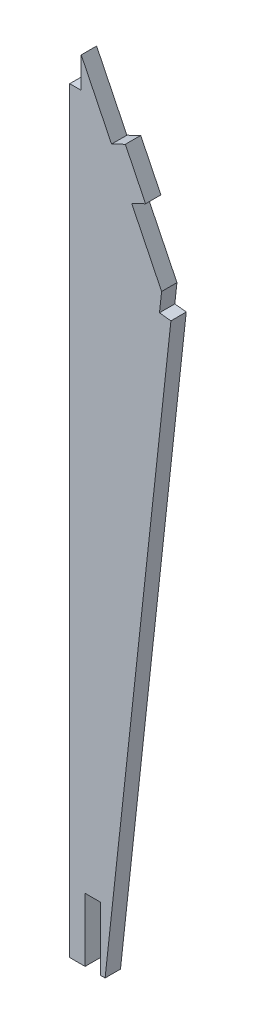
ISO-10303-21;
HEADER;
FILE_DESCRIPTION(('STEP AP214'),'2;1');
FILE_NAME('part.step','',(''),(''),'','','');
FILE_SCHEMA(('AUTOMOTIVE_DESIGN { 1 0 10303 214 1 1 1 1 }'));
ENDSEC;
DATA;
#1=APPLICATION_CONTEXT('core data for automotive mechanical design processes');
#2=APPLICATION_PROTOCOL_DEFINITION('international standard','automotive_design',2000,#1);
#3=PRODUCT_CONTEXT('',#1,'mechanical');
#4=PRODUCT('Part','Part','',(#3));
#5=PRODUCT_RELATED_PRODUCT_CATEGORY('part','',(#4));
#6=PRODUCT_DEFINITION_FORMATION('','',#4);
#7=PRODUCT_DEFINITION_CONTEXT('part definition',#1,'design');
#8=PRODUCT_DEFINITION('design','',#6,#7);
#9=PRODUCT_DEFINITION_SHAPE('','',#8);
#10=(LENGTH_UNIT() NAMED_UNIT(*) SI_UNIT(.MILLI.,.METRE.));
#11=(NAMED_UNIT(*) PLANE_ANGLE_UNIT() SI_UNIT($,.RADIAN.));
#12=(NAMED_UNIT(*) SI_UNIT($,.STERADIAN.) SOLID_ANGLE_UNIT());
#13=UNCERTAINTY_MEASURE_WITH_UNIT(LENGTH_MEASURE(1.E-05),#10,'distance_accuracy_value','');
#14=(GEOMETRIC_REPRESENTATION_CONTEXT(3) GLOBAL_UNCERTAINTY_ASSIGNED_CONTEXT((#13)) GLOBAL_UNIT_ASSIGNED_CONTEXT((#10,
#11,#12)) REPRESENTATION_CONTEXT('',''));
#15=CARTESIAN_POINT('',(0.,0.,0.));
#16=DIRECTION('',(0.,0.,1.));
#17=DIRECTION('',(1.,0.,0.));
#18=AXIS2_PLACEMENT_3D('',#15,#16,#17);
#19=CARTESIAN_POINT('',(9.18341639626626,84.0040838389916,2.));
#20=DIRECTION('',(0.108673615067687,0.994077484599727,0.));
#21=DIRECTION('',(-0.994077484599727,0.108673615067687,0.));
#22=AXIS2_PLACEMENT_3D('',#19,#20,#21);
#23=PLANE('',#22);
#24=DIRECTION('',(0.994077484599727,-0.108673615067687,0.));
#25=VECTOR('',#24,1.);
#26=CARTESIAN_POINT('',(9.18341639626626,84.0040838389916,0.));
#27=LINE('',#26,#25);
#28=CARTESIAN_POINT('',(28.3246380316323,81.9115449935266,0.));
#29=VERTEX_POINT('',#28);
#30=CARTESIAN_POINT('',(29.8157542585313,81.7485345709251,0.));
#31=VERTEX_POINT('',#30);
#32=EDGE_CURVE('E178',#29,#31,#27,.T.);
#33=ORIENTED_EDGE('',*,*,#32,.F.);
#34=DIRECTION('',(0.,0.,-1.));
#35=VECTOR('',#34,1.);
#36=CARTESIAN_POINT('',(28.3246380316323,81.9115449935266,2.));
#37=LINE('',#36,#35);
#38=CARTESIAN_POINT('',(28.3246380316323,81.9115449935266,2.));
#39=VERTEX_POINT('',#38);
#40=EDGE_CURVE('E11',#39,#29,#37,.T.);
#41=ORIENTED_EDGE('',*,*,#40,.F.);
#42=DIRECTION('',(0.994077484599727,-0.108673615067687,0.));
#43=VECTOR('',#42,1.);
#44=CARTESIAN_POINT('',(9.18341639626626,84.0040838389916,2.));
#45=LINE('',#44,#43);
#46=CARTESIAN_POINT('',(29.8157542585313,81.7485345709251,2.));
#47=VERTEX_POINT('',#46);
#48=EDGE_CURVE('E216',#39,#47,#45,.T.);
#49=ORIENTED_EDGE('',*,*,#48,.T.);
#50=DIRECTION('',(0.,0.,-1.));
#51=VECTOR('',#50,1.);
#52=CARTESIAN_POINT('',(29.8157542585313,81.7485345709251,2.));
#53=LINE('',#52,#51);
#54=EDGE_CURVE('E53',#47,#31,#53,.T.);
#55=ORIENTED_EDGE('',*,*,#54,.T.);
#56=EDGE_LOOP('',(#33,#41,#49,#55));
#57=FACE_BOUND('',#56,.T.);
#58=ADVANCED_FACE('F37',(#57),#23,.T.);
#59=CARTESIAN_POINT('',(19.1412216353933,-2.09253884546182,2.));
#60=DIRECTION('',(0.994077484599761,-0.108673615067372,0.));
#61=DIRECTION('',(0.108673615067372,0.994077484599761,0.));
#62=AXIS2_PLACEMENT_3D('',#59,#60,#61);
#63=PLANE('',#62);
#64=DIRECTION('',(-0.108673615067372,-0.994077484599761,0.));
#65=VECTOR('',#64,1.);
#66=CARTESIAN_POINT('',(19.1412216353933,-2.09253884546182,0.));
#67=LINE('',#66,#65);
#68=CARTESIAN_POINT('',(28.602188069689,84.4503971657941,0.));
#69=VERTEX_POINT('',#68);
#70=EDGE_CURVE('E180',#69,#29,#67,.T.);
#71=ORIENTED_EDGE('',*,*,#70,.F.);
#72=DIRECTION('',(0.,0.,-1.));
#73=VECTOR('',#72,1.);
#74=CARTESIAN_POINT('',(28.602188069689,84.4503971657941,2.));
#75=LINE('',#74,#73);
#76=CARTESIAN_POINT('',(28.602188069689,84.4503971657941,2.));
#77=VERTEX_POINT('',#76);
#78=EDGE_CURVE('E45',#77,#69,#75,.T.);
#79=ORIENTED_EDGE('',*,*,#78,.F.);
#80=DIRECTION('',(-0.108673615067372,-0.994077484599761,0.));
#81=VECTOR('',#80,1.);
#82=CARTESIAN_POINT('',(19.1412216353933,-2.09253884546182,2.));
#83=LINE('',#82,#81);
#84=EDGE_CURVE('E266',#77,#39,#83,.T.);
#85=ORIENTED_EDGE('',*,*,#84,.T.);
#86=ORIENTED_EDGE('',*,*,#40,.T.);
#87=EDGE_LOOP('',(#71,#79,#85,#86));
#88=FACE_BOUND('',#87,.T.);
#89=ADVANCED_FACE('F254',(#88),#63,.T.);
#90=CARTESIAN_POINT('',(56.3796372436013,27.4981864152053,2.));
#91=DIRECTION('',(0.898794046299296,0.438371146788812,0.));
#92=DIRECTION('',(-0.438371146788812,0.898794046299296,0.));
#93=AXIS2_PLACEMENT_3D('',#90,#91,#92);
#94=PLANE('',#93);
#95=DIRECTION('',(0.438371146788812,-0.898794046299296,0.));
#96=VECTOR('',#95,1.);
#97=CARTESIAN_POINT('',(56.3796372436013,27.4981864152053,0.));
#98=LINE('',#97,#96);
#99=CARTESIAN_POINT('',(24.7141798918283,92.4219952689596,0.));
#100=VERTEX_POINT('',#99);
#101=EDGE_CURVE('E183',#100,#69,#98,.T.);
#102=ORIENTED_EDGE('',*,*,#101,.F.);
#103=DIRECTION('',(0.,0.,-1.));
#104=VECTOR('',#103,1.);
#105=CARTESIAN_POINT('',(24.7141798918283,92.4219952689596,2.));
#106=LINE('',#105,#104);
#107=CARTESIAN_POINT('',(24.7141798918283,92.4219952689596,2.));
#108=VERTEX_POINT('',#107);
#109=EDGE_CURVE('E243',#108,#100,#106,.T.);
#110=ORIENTED_EDGE('',*,*,#109,.F.);
#111=DIRECTION('',(0.438371146788812,-0.898794046299296,0.));
#112=VECTOR('',#111,1.);
#113=CARTESIAN_POINT('',(56.3796372436013,27.4981864152053,2.));
#114=LINE('',#113,#112);
#115=EDGE_CURVE('E250',#108,#77,#114,.T.);
#116=ORIENTED_EDGE('',*,*,#115,.T.);
#117=ORIENTED_EDGE('',*,*,#78,.T.);
#118=EDGE_LOOP('',(#102,#110,#116,#117));
#119=FACE_BOUND('',#118,.T.);
#120=ADVANCED_FACE('F248',(#119),#94,.T.);
#121=CARTESIAN_POINT('',(-31.6654573517778,64.9238088537431,2.));
#122=DIRECTION('',(0.438371146788926,-0.898794046299241,0.));
#123=DIRECTION('',(0.898794046299241,0.438371146788927,0.));
#124=AXIS2_PLACEMENT_3D('',#121,#122,#123);
#125=PLANE('',#124);
#126=DIRECTION('',(-0.898794046299241,-0.438371146788927,0.));
#127=VECTOR('',#126,1.);
#128=CARTESIAN_POINT('',(-31.6654573517778,64.9238088537431,0.));
#129=LINE('',#128,#127);
#130=CARTESIAN_POINT('',(26.511767984427,93.2987375625376,0.));
#131=VERTEX_POINT('',#130);
#132=EDGE_CURVE('E186',#131,#100,#129,.T.);
#133=ORIENTED_EDGE('',*,*,#132,.F.);
#134=DIRECTION('',(0.,0.,-1.));
#135=VECTOR('',#134,1.);
#136=CARTESIAN_POINT('',(26.511767984427,93.2987375625376,2.));
#137=LINE('',#136,#135);
#138=CARTESIAN_POINT('',(26.511767984427,93.2987375625376,2.));
#139=VERTEX_POINT('',#138);
#140=EDGE_CURVE('E241',#139,#131,#137,.T.);
#141=ORIENTED_EDGE('',*,*,#140,.F.);
#142=DIRECTION('',(-0.898794046299241,-0.438371146788927,0.));
#143=VECTOR('',#142,1.);
#144=CARTESIAN_POINT('',(-31.6654573517778,64.9238088537431,2.));
#145=LINE('',#144,#143);
#146=EDGE_CURVE('E263',#139,#108,#145,.T.);
#147=ORIENTED_EDGE('',*,*,#146,.T.);
#148=ORIENTED_EDGE('',*,*,#109,.T.);
#149=EDGE_LOOP('',(#133,#141,#147,#148));
#150=FACE_BOUND('',#149,.T.);
#151=ADVANCED_FACE('F260',(#150),#125,.T.);
#152=CARTESIAN_POINT('',(58.1772253362309,28.3749287088587,2.));
#153=DIRECTION('',(0.898794046298927,0.438371146789569,0.));
#154=DIRECTION('',(-0.438371146789569,0.898794046298927,0.));
#155=AXIS2_PLACEMENT_3D('',#152,#153,#154);
#156=PLANE('',#155);
#157=DIRECTION('',(0.438371146789569,-0.898794046298927,0.));
#158=VECTOR('',#157,1.);
#159=CARTESIAN_POINT('',(58.1772253362309,28.3749287088587,0.));
#160=LINE('',#159,#158);
#161=CARTESIAN_POINT('',(23.8815411036894,98.6915018403315,0.));
#162=VERTEX_POINT('',#161);
#163=EDGE_CURVE('E189',#162,#131,#160,.T.);
#164=ORIENTED_EDGE('',*,*,#163,.F.);
#165=DIRECTION('',(0.,0.,-1.));
#166=VECTOR('',#165,1.);
#167=CARTESIAN_POINT('',(23.8815411036894,98.6915018403315,2.));
#168=LINE('',#167,#166);
#169=CARTESIAN_POINT('',(23.8815411036894,98.6915018403315,2.));
#170=VERTEX_POINT('',#169);
#171=EDGE_CURVE('E239',#170,#162,#168,.T.);
#172=ORIENTED_EDGE('',*,*,#171,.F.);
#173=DIRECTION('',(0.438371146789569,-0.898794046298927,0.));
#174=VECTOR('',#173,1.);
#175=CARTESIAN_POINT('',(58.1772253362309,28.3749287088587,2.));
#176=LINE('',#175,#174);
#177=EDGE_CURVE('E268',#170,#139,#176,.T.);
#178=ORIENTED_EDGE('',*,*,#177,.T.);
#179=ORIENTED_EDGE('',*,*,#140,.T.);
#180=EDGE_LOOP('',(#164,#172,#178,#179));
#181=FACE_BOUND('',#180,.T.);
#182=ADVANCED_FACE('F320',(#181),#156,.T.);
#183=CARTESIAN_POINT('',(-34.295684232511,70.3165731315401,2.));
#184=DIRECTION('',(-0.438371146788915,0.898794046299246,0.));
#185=DIRECTION('',(-0.898794046299246,-0.438371146788915,0.));
#186=AXIS2_PLACEMENT_3D('',#183,#184,#185);
#187=PLANE('',#186);
#188=DIRECTION('',(0.898794046299246,0.438371146788915,0.));
#189=VECTOR('',#188,1.);
#190=CARTESIAN_POINT('',(-34.295684232511,70.3165731315401,0.));
#191=LINE('',#190,#189);
#192=CARTESIAN_POINT('',(22.0839530110934,97.8147595467549,0.));
#193=VERTEX_POINT('',#192);
#194=EDGE_CURVE('E192',#193,#162,#191,.T.);
#195=ORIENTED_EDGE('',*,*,#194,.F.);
#196=DIRECTION('',(0.,0.,-1.));
#197=VECTOR('',#196,1.);
#198=CARTESIAN_POINT('',(22.0839530110934,97.8147595467549,2.));
#199=LINE('',#198,#197);
#200=CARTESIAN_POINT('',(22.0839530110934,97.8147595467549,2.));
#201=VERTEX_POINT('',#200);
#202=EDGE_CURVE('E237',#201,#193,#199,.T.);
#203=ORIENTED_EDGE('',*,*,#202,.F.);
#204=DIRECTION('',(0.898794046299246,0.438371146788915,0.));
#205=VECTOR('',#204,1.);
#206=CARTESIAN_POINT('',(-34.295684232511,70.3165731315401,2.));
#207=LINE('',#206,#205);
#208=EDGE_CURVE('E274',#201,#170,#207,.T.);
#209=ORIENTED_EDGE('',*,*,#208,.T.);
#210=ORIENTED_EDGE('',*,*,#171,.T.);
#211=EDGE_LOOP('',(#195,#203,#209,#210));
#212=FACE_BOUND('',#211,.T.);
#213=ADVANCED_FACE('F323',(#212),#187,.T.);
#214=CARTESIAN_POINT('',(56.3796372436186,27.4981864152449,2.));
#215=DIRECTION('',(0.898794046299101,0.438371146789213,0.));
#216=DIRECTION('',(-0.438371146789213,0.898794046299101,0.));
#217=AXIS2_PLACEMENT_3D('',#214,#215,#216);
#218=PLANE('',#217);
#219=DIRECTION('',(0.438371146789213,-0.898794046299101,0.));
#220=VECTOR('',#219,1.);
#221=CARTESIAN_POINT('',(56.3796372436186,27.4981864152449,0.));
#222=LINE('',#221,#220);
#223=CARTESIAN_POINT('',(18.1386126899906,105.903905963447,0.));
#224=VERTEX_POINT('',#223);
#225=EDGE_CURVE('E195',#224,#193,#222,.T.);
#226=ORIENTED_EDGE('',*,*,#225,.F.);
#227=DIRECTION('',(0.,0.,-1.));
#228=VECTOR('',#227,1.);
#229=CARTESIAN_POINT('',(18.1386126899906,105.903905963447,2.));
#230=LINE('',#229,#228);
#231=CARTESIAN_POINT('',(18.1386126899906,105.903905963447,2.));
#232=VERTEX_POINT('',#231);
#233=EDGE_CURVE('E235',#232,#224,#230,.T.);
#234=ORIENTED_EDGE('',*,*,#233,.F.);
#235=DIRECTION('',(0.438371146789213,-0.898794046299101,0.));
#236=VECTOR('',#235,1.);
#237=CARTESIAN_POINT('',(56.3796372436186,27.4981864152449,2.));
#238=LINE('',#237,#236);
#239=EDGE_CURVE('E277',#232,#201,#238,.T.);
#240=ORIENTED_EDGE('',*,*,#239,.T.);
#241=ORIENTED_EDGE('',*,*,#202,.T.);
#242=EDGE_LOOP('',(#226,#234,#240,#241));
#243=FACE_BOUND('',#242,.T.);
#244=ADVANCED_FACE('F327',(#243),#218,.T.);
#245=CARTESIAN_POINT('',(18.1386126899906,0.,2.));
#246=DIRECTION('',(1.,0.,0.));
#247=DIRECTION('',(0.,0.,-1.));
#248=AXIS2_PLACEMENT_3D('',#245,#246,#247);
#249=PLANE('',#248);
#250=DIRECTION('',(0.,-1.,0.));
#251=VECTOR('',#250,1.);
#252=CARTESIAN_POINT('',(18.1386126899906,0.,0.));
#253=LINE('',#252,#251);
#254=CARTESIAN_POINT('',(18.1386126899906,101.903905963448,0.));
#255=VERTEX_POINT('',#254);
#256=EDGE_CURVE('E198',#224,#255,#253,.T.);
#257=ORIENTED_EDGE('',*,*,#256,.T.);
#258=DIRECTION('',(0.,0.,-1.));
#259=VECTOR('',#258,1.);
#260=CARTESIAN_POINT('',(18.1386126899906,101.903905963448,2.));
#261=LINE('',#260,#259);
#262=CARTESIAN_POINT('',(18.1386126899906,101.903905963448,2.));
#263=VERTEX_POINT('',#262);
#264=EDGE_CURVE('E232',#263,#255,#261,.T.);
#265=ORIENTED_EDGE('',*,*,#264,.F.);
#266=DIRECTION('',(0.,-1.,0.));
#267=VECTOR('',#266,1.);
#268=CARTESIAN_POINT('',(18.1386126899906,0.,2.));
#269=LINE('',#268,#267);
#270=EDGE_CURVE('E280',#232,#263,#269,.T.);
#271=ORIENTED_EDGE('',*,*,#270,.F.);
#272=ORIENTED_EDGE('',*,*,#233,.T.);
#273=EDGE_LOOP('',(#257,#265,#271,#272));
#274=FACE_BOUND('',#273,.T.);
#275=ADVANCED_FACE('F331',(#274),#249,.F.);
#276=CARTESIAN_POINT('',(0.,101.903905963448,2.));
#277=DIRECTION('',(0.,-1.,0.));
#278=DIRECTION('',(0.,0.,-1.));
#279=AXIS2_PLACEMENT_3D('',#276,#277,#278);
#280=PLANE('',#279);
#281=DIRECTION('',(-1.,0.,0.));
#282=VECTOR('',#281,1.);
#283=CARTESIAN_POINT('',(0.,101.903905963448,0.));
#284=LINE('',#283,#282);
#285=CARTESIAN_POINT('',(16.6386126899906,101.903905963448,0.));
#286=VERTEX_POINT('',#285);
#287=EDGE_CURVE('E200',#255,#286,#284,.T.);
#288=ORIENTED_EDGE('',*,*,#287,.T.);
#289=DIRECTION('',(0.,0.,-1.));
#290=VECTOR('',#289,1.);
#291=CARTESIAN_POINT('',(16.6386126899906,101.903905963448,2.));
#292=LINE('',#291,#290);
#293=CARTESIAN_POINT('',(16.6386126899906,101.903905963448,2.));
#294=VERTEX_POINT('',#293);
#295=EDGE_CURVE('E229',#294,#286,#292,.T.);
#296=ORIENTED_EDGE('',*,*,#295,.F.);
#297=DIRECTION('',(-1.,0.,0.));
#298=VECTOR('',#297,1.);
#299=CARTESIAN_POINT('',(0.,101.903905963448,2.));
#300=LINE('',#299,#298);
#301=EDGE_CURVE('E282',#263,#294,#300,.T.);
#302=ORIENTED_EDGE('',*,*,#301,.F.);
#303=ORIENTED_EDGE('',*,*,#264,.T.);
#304=EDGE_LOOP('',(#288,#296,#302,#303));
#305=FACE_BOUND('',#304,.T.);
#306=ADVANCED_FACE('F335',(#305),#280,.F.);
#307=CARTESIAN_POINT('',(16.6386126899906,0.,2.));
#308=DIRECTION('',(1.,0.,0.));
#309=DIRECTION('',(0.,0.,-1.));
#310=AXIS2_PLACEMENT_3D('',#307,#308,#309);
#311=PLANE('',#310);
#312=DIRECTION('',(0.,-1.,0.));
#313=VECTOR('',#312,1.);
#314=CARTESIAN_POINT('',(16.6386126899906,0.,0.));
#315=LINE('',#314,#313);
#316=CARTESIAN_POINT('',(16.6386126899906,3.35464728489524,0.));
#317=VERTEX_POINT('',#316);
#318=EDGE_CURVE('E202',#286,#317,#315,.T.);
#319=ORIENTED_EDGE('',*,*,#318,.T.);
#320=DIRECTION('',(0.,0.,-1.));
#321=VECTOR('',#320,1.);
#322=CARTESIAN_POINT('',(16.6386126899906,3.35464728489524,2.));
#323=LINE('',#322,#321);
#324=CARTESIAN_POINT('',(16.6386126899906,3.35464728489524,2.));
#325=VERTEX_POINT('',#324);
#326=EDGE_CURVE('E226',#325,#317,#323,.T.);
#327=ORIENTED_EDGE('',*,*,#326,.F.);
#328=DIRECTION('',(0.,-1.,0.));
#329=VECTOR('',#328,1.);
#330=CARTESIAN_POINT('',(16.6386126899906,0.,2.));
#331=LINE('',#330,#329);
#332=EDGE_CURVE('E284',#294,#325,#331,.T.);
#333=ORIENTED_EDGE('',*,*,#332,.F.);
#334=ORIENTED_EDGE('',*,*,#295,.T.);
#335=EDGE_LOOP('',(#319,#327,#333,#334));
#336=FACE_BOUND('',#335,.T.);
#337=ADVANCED_FACE('F339',(#336),#311,.F.);
#338=CARTESIAN_POINT('',(0.,3.35464728489524,2.));
#339=DIRECTION('',(0.,1.,0.));
#340=DIRECTION('',(0.,0.,1.));
#341=AXIS2_PLACEMENT_3D('',#338,#339,#340);
#342=PLANE('',#341);
#343=DIRECTION('',(1.,0.,0.));
#344=VECTOR('',#343,1.);
#345=CARTESIAN_POINT('',(0.,3.35464728489524,0.));
#346=LINE('',#345,#344);
#347=CARTESIAN_POINT('',(18.6386126899915,3.35464728489524,0.));
#348=VERTEX_POINT('',#347);
#349=EDGE_CURVE('E204',#317,#348,#346,.T.);
#350=ORIENTED_EDGE('',*,*,#349,.T.);
#351=DIRECTION('',(0.,0.,-1.));
#352=VECTOR('',#351,1.);
#353=CARTESIAN_POINT('',(18.6386126899915,3.35464728489524,2.));
#354=LINE('',#353,#352);
#355=CARTESIAN_POINT('',(18.6386126899915,3.35464728489524,2.));
#356=VERTEX_POINT('',#355);
#357=EDGE_CURVE('E223',#356,#348,#354,.T.);
#358=ORIENTED_EDGE('',*,*,#357,.F.);
#359=DIRECTION('',(1.,0.,0.));
#360=VECTOR('',#359,1.);
#361=CARTESIAN_POINT('',(0.,3.35464728489524,2.));
#362=LINE('',#361,#360);
#363=EDGE_CURVE('E286',#325,#356,#362,.T.);
#364=ORIENTED_EDGE('',*,*,#363,.F.);
#365=ORIENTED_EDGE('',*,*,#326,.T.);
#366=EDGE_LOOP('',(#350,#358,#364,#365));
#367=FACE_BOUND('',#366,.T.);
#368=ADVANCED_FACE('F343',(#367),#342,.F.);
#369=CARTESIAN_POINT('',(18.6386126899915,0.,2.));
#370=DIRECTION('',(-1.,0.,0.));
#371=DIRECTION('',(0.,0.,1.));
#372=AXIS2_PLACEMENT_3D('',#369,#370,#371);
#373=PLANE('',#372);
#374=DIRECTION('',(0.,1.,0.));
#375=VECTOR('',#374,1.);
#376=CARTESIAN_POINT('',(18.6386126899915,0.,0.));
#377=LINE('',#376,#375);
#378=CARTESIAN_POINT('',(18.6386126899915,11.6046472849062,0.));
#379=VERTEX_POINT('',#378);
#380=EDGE_CURVE('E206',#348,#379,#377,.T.);
#381=ORIENTED_EDGE('',*,*,#380,.T.);
#382=DIRECTION('',(0.,0.,-1.));
#383=VECTOR('',#382,1.);
#384=CARTESIAN_POINT('',(18.6386126899915,11.6046472849062,2.));
#385=LINE('',#384,#383);
#386=CARTESIAN_POINT('',(18.6386126899915,11.6046472849062,2.));
#387=VERTEX_POINT('',#386);
#388=EDGE_CURVE('E220',#387,#379,#385,.T.);
#389=ORIENTED_EDGE('',*,*,#388,.F.);
#390=DIRECTION('',(0.,1.,0.));
#391=VECTOR('',#390,1.);
#392=CARTESIAN_POINT('',(18.6386126899915,0.,2.));
#393=LINE('',#392,#391);
#394=EDGE_CURVE('E288',#356,#387,#393,.T.);
#395=ORIENTED_EDGE('',*,*,#394,.F.);
#396=ORIENTED_EDGE('',*,*,#357,.T.);
#397=EDGE_LOOP('',(#381,#389,#395,#396));
#398=FACE_BOUND('',#397,.T.);
#399=ADVANCED_FACE('F294',(#398),#373,.F.);
#400=CARTESIAN_POINT('',(0.,11.6046472849062,2.));
#401=DIRECTION('',(0.,1.,0.));
#402=DIRECTION('',(0.,0.,1.));
#403=AXIS2_PLACEMENT_3D('',#400,#401,#402);
#404=PLANE('',#403);
#405=DIRECTION('',(1.,0.,0.));
#406=VECTOR('',#405,1.);
#407=CARTESIAN_POINT('',(0.,11.6046472849062,0.));
#408=LINE('',#407,#406);
#409=CARTESIAN_POINT('',(20.6386126899915,11.6046472849062,0.));
#410=VERTEX_POINT('',#409);
#411=EDGE_CURVE('E208',#379,#410,#408,.T.);
#412=ORIENTED_EDGE('',*,*,#411,.T.);
#413=DIRECTION('',(0.,0.,-1.));
#414=VECTOR('',#413,1.);
#415=CARTESIAN_POINT('',(20.6386126899915,11.6046472849062,2.));
#416=LINE('',#415,#414);
#417=CARTESIAN_POINT('',(20.6386126899915,11.6046472849062,2.));
#418=VERTEX_POINT('',#417);
#419=EDGE_CURVE('E170',#418,#410,#416,.T.);
#420=ORIENTED_EDGE('',*,*,#419,.F.);
#421=DIRECTION('',(1.,0.,0.));
#422=VECTOR('',#421,1.);
#423=CARTESIAN_POINT('',(0.,11.6046472849062,2.));
#424=LINE('',#423,#422);
#425=EDGE_CURVE('E158',#387,#418,#424,.T.);
#426=ORIENTED_EDGE('',*,*,#425,.F.);
#427=ORIENTED_EDGE('',*,*,#388,.T.);
#428=EDGE_LOOP('',(#412,#420,#426,#427));
#429=FACE_BOUND('',#428,.T.);
#430=ADVANCED_FACE('F298',(#429),#404,.F.);
#431=CARTESIAN_POINT('',(20.6386126899915,0.,2.));
#432=DIRECTION('',(1.,0.,0.));
#433=DIRECTION('',(0.,0.,-1.));
#434=AXIS2_PLACEMENT_3D('',#431,#432,#433);
#435=PLANE('',#434);
#436=DIRECTION('',(0.,-1.,0.));
#437=VECTOR('',#436,1.);
#438=CARTESIAN_POINT('',(20.6386126899915,0.,0.));
#439=LINE('',#438,#437);
#440=CARTESIAN_POINT('',(20.6386126899915,3.35464728489524,0.));
#441=VERTEX_POINT('',#440);
#442=EDGE_CURVE('E167',#410,#441,#439,.T.);
#443=ORIENTED_EDGE('',*,*,#442,.T.);
#444=DIRECTION('',(0.,0.,-1.));
#445=VECTOR('',#444,1.);
#446=CARTESIAN_POINT('',(20.6386126899915,3.35464728489524,2.));
#447=LINE('',#446,#445);
#448=CARTESIAN_POINT('',(20.6386126899915,3.35464728489524,2.));
#449=VERTEX_POINT('',#448);
#450=EDGE_CURVE('E164',#449,#441,#447,.T.);
#451=ORIENTED_EDGE('',*,*,#450,.F.);
#452=DIRECTION('',(0.,-1.,0.));
#453=VECTOR('',#452,1.);
#454=CARTESIAN_POINT('',(20.6386126899915,0.,2.));
#455=LINE('',#454,#453);
#456=EDGE_CURVE('E151',#418,#449,#455,.T.);
#457=ORIENTED_EDGE('',*,*,#456,.F.);
#458=ORIENTED_EDGE('',*,*,#419,.T.);
#459=EDGE_LOOP('',(#443,#451,#457,#458));
#460=FACE_BOUND('',#459,.T.);
#461=ADVANCED_FACE('F165',(#460),#435,.F.);
#462=CARTESIAN_POINT('',(0.,3.35464728489524,2.));
#463=DIRECTION('',(0.,1.,0.));
#464=DIRECTION('',(0.,0.,1.));
#465=AXIS2_PLACEMENT_3D('',#462,#463,#464);
#466=PLANE('',#465);
#467=DIRECTION('',(1.,0.,0.));
#468=VECTOR('',#467,1.);
#469=CARTESIAN_POINT('',(0.,3.35464728489524,0.));
#470=LINE('',#469,#468);
#471=CARTESIAN_POINT('',(21.2456505567971,3.35464728489524,0.));
#472=VERTEX_POINT('',#471);
#473=EDGE_CURVE('E211',#441,#472,#470,.T.);
#474=ORIENTED_EDGE('',*,*,#473,.T.);
#475=DIRECTION('',(0.,0.,-1.));
#476=VECTOR('',#475,1.);
#477=CARTESIAN_POINT('',(21.2456505567971,3.35464728489524,2.));
#478=LINE('',#477,#476);
#479=CARTESIAN_POINT('',(21.2456505567971,3.35464728489524,2.));
#480=VERTEX_POINT('',#479);
#481=EDGE_CURVE('E103',#480,#472,#478,.T.);
#482=ORIENTED_EDGE('',*,*,#481,.F.);
#483=DIRECTION('',(1.,0.,0.));
#484=VECTOR('',#483,1.);
#485=CARTESIAN_POINT('',(0.,3.35464728489524,2.));
#486=LINE('',#485,#484);
#487=EDGE_CURVE('E156',#449,#480,#486,.T.);
#488=ORIENTED_EDGE('',*,*,#487,.F.);
#489=ORIENTED_EDGE('',*,*,#450,.T.);
#490=EDGE_LOOP('',(#474,#482,#488,#489));
#491=FACE_BOUND('',#490,.T.);
#492=ADVANCED_FACE('F172',(#491),#466,.F.);
#493=CARTESIAN_POINT('',(20.6323378622681,-2.25554926806605,2.));
#494=DIRECTION('',(0.994077484599731,-0.108673615067651,0.));
#495=DIRECTION('',(0.108673615067651,0.994077484599731,0.));
#496=AXIS2_PLACEMENT_3D('',#493,#494,#495);
#497=PLANE('',#496);
#498=DIRECTION('',(-0.108673615067651,-0.994077484599731,0.));
#499=VECTOR('',#498,1.);
#500=CARTESIAN_POINT('',(20.6323378622681,-2.25554926806605,0.));
#501=LINE('',#500,#499);
#502=EDGE_CURVE('E213',#31,#472,#501,.T.);
#503=ORIENTED_EDGE('',*,*,#502,.F.);
#504=ORIENTED_EDGE('',*,*,#54,.F.);
#505=DIRECTION('',(-0.108673615067651,-0.994077484599731,0.));
#506=VECTOR('',#505,1.);
#507=CARTESIAN_POINT('',(20.6323378622681,-2.25554926806605,2.));
#508=LINE('',#507,#506);
#509=EDGE_CURVE('E173',#47,#480,#508,.T.);
#510=ORIENTED_EDGE('',*,*,#509,.T.);
#511=ORIENTED_EDGE('',*,*,#481,.T.);
#512=EDGE_LOOP('',(#503,#504,#510,#511));
#513=FACE_BOUND('',#512,.T.);
#514=ADVANCED_FACE('F299',(#513),#497,.T.);
#515=CARTESIAN_POINT('',(0.,0.,2.));
#516=DIRECTION('',(0.,0.,1.));
#517=DIRECTION('',(1.,0.,0.));
#518=AXIS2_PLACEMENT_3D('',#515,#516,#517);
#519=PLANE('',#518);
#520=ORIENTED_EDGE('',*,*,#48,.F.);
#521=ORIENTED_EDGE('',*,*,#84,.F.);
#522=ORIENTED_EDGE('',*,*,#115,.F.);
#523=ORIENTED_EDGE('',*,*,#146,.F.);
#524=ORIENTED_EDGE('',*,*,#177,.F.);
#525=ORIENTED_EDGE('',*,*,#208,.F.);
#526=ORIENTED_EDGE('',*,*,#239,.F.);
#527=ORIENTED_EDGE('',*,*,#270,.T.);
#528=ORIENTED_EDGE('',*,*,#301,.T.);
#529=ORIENTED_EDGE('',*,*,#332,.T.);
#530=ORIENTED_EDGE('',*,*,#363,.T.);
#531=ORIENTED_EDGE('',*,*,#394,.T.);
#532=ORIENTED_EDGE('',*,*,#425,.T.);
#533=ORIENTED_EDGE('',*,*,#456,.T.);
#534=ORIENTED_EDGE('',*,*,#487,.T.);
#535=ORIENTED_EDGE('',*,*,#509,.F.);
#536=EDGE_LOOP('',(#520,#521,#522,#523,#524,#525,#526,#527,#528,#529,#530,#531,#532,#533,#534,#535));
#537=FACE_BOUND('',#536,.T.);
#538=ADVANCED_FACE('F153',(#537),#519,.T.);
#539=CARTESIAN_POINT('',(0.,0.,0.));
#540=DIRECTION('',(0.,0.,1.));
#541=DIRECTION('',(1.,0.,0.));
#542=AXIS2_PLACEMENT_3D('',#539,#540,#541);
#543=PLANE('',#542);
#544=ORIENTED_EDGE('',*,*,#32,.T.);
#545=ORIENTED_EDGE('',*,*,#502,.T.);
#546=ORIENTED_EDGE('',*,*,#473,.F.);
#547=ORIENTED_EDGE('',*,*,#442,.F.);
#548=ORIENTED_EDGE('',*,*,#411,.F.);
#549=ORIENTED_EDGE('',*,*,#380,.F.);
#550=ORIENTED_EDGE('',*,*,#349,.F.);
#551=ORIENTED_EDGE('',*,*,#318,.F.);
#552=ORIENTED_EDGE('',*,*,#287,.F.);
#553=ORIENTED_EDGE('',*,*,#256,.F.);
#554=ORIENTED_EDGE('',*,*,#225,.T.);
#555=ORIENTED_EDGE('',*,*,#194,.T.);
#556=ORIENTED_EDGE('',*,*,#163,.T.);
#557=ORIENTED_EDGE('',*,*,#132,.T.);
#558=ORIENTED_EDGE('',*,*,#101,.T.);
#559=ORIENTED_EDGE('',*,*,#70,.T.);
#560=EDGE_LOOP('',(#544,#545,#546,#547,#548,#549,#550,#551,#552,#553,#554,#555,#556,#557,#558,#559));
#561=FACE_BOUND('',#560,.T.);
#562=ADVANCED_FACE('F256',(#561),#543,.F.);
#563=CLOSED_SHELL('',(#58,#89,#120,#151,#182,#213,#244,#275,#306,#337,#368,#399,#430,#461,#492,
#514,#538,#562));
#564=MANIFOLD_SOLID_BREP('B2',#563);
#565=ADVANCED_BREP_SHAPE_REPRESENTATION('',(#18,#564),#14);
#566=SHAPE_DEFINITION_REPRESENTATION(#9,#565);
ENDSEC;
END-ISO-10303-21;
